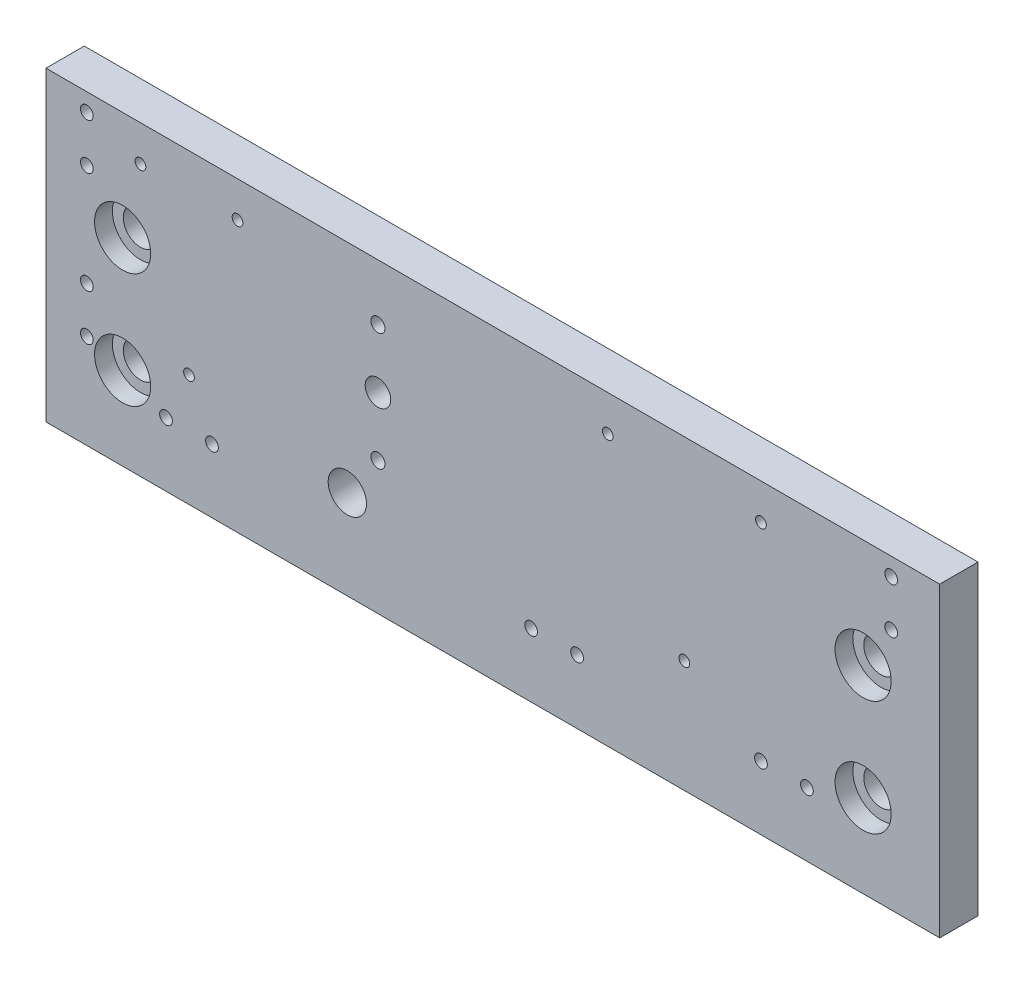
ISO-10303-21;
HEADER;
FILE_DESCRIPTION(('STEP AP214'),'2;1');
FILE_NAME('part.step','',(''),(''),'','','');
FILE_SCHEMA(('AUTOMOTIVE_DESIGN { 1 0 10303 214 1 1 1 1 }'));
ENDSEC;
DATA;
#1=APPLICATION_CONTEXT('core data for automotive mechanical design processes');
#2=APPLICATION_PROTOCOL_DEFINITION('international standard','automotive_design',2000,#1);
#3=PRODUCT_CONTEXT('',#1,'mechanical');
#4=PRODUCT('Part','Part','',(#3));
#5=PRODUCT_RELATED_PRODUCT_CATEGORY('part','',(#4));
#6=PRODUCT_DEFINITION_FORMATION('','',#4);
#7=PRODUCT_DEFINITION_CONTEXT('part definition',#1,'design');
#8=PRODUCT_DEFINITION('design','',#6,#7);
#9=PRODUCT_DEFINITION_SHAPE('','',#8);
#10=(LENGTH_UNIT() NAMED_UNIT(*) SI_UNIT(.MILLI.,.METRE.));
#11=(NAMED_UNIT(*) PLANE_ANGLE_UNIT() SI_UNIT($,.RADIAN.));
#12=(NAMED_UNIT(*) SI_UNIT($,.STERADIAN.) SOLID_ANGLE_UNIT());
#13=UNCERTAINTY_MEASURE_WITH_UNIT(LENGTH_MEASURE(1.E-05),#10,'distance_accuracy_value','');
#14=(GEOMETRIC_REPRESENTATION_CONTEXT(3) GLOBAL_UNCERTAINTY_ASSIGNED_CONTEXT((#13)) GLOBAL_UNIT_ASSIGNED_CONTEXT((#10,
#11,#12)) REPRESENTATION_CONTEXT('',''));
#15=CARTESIAN_POINT('',(0.,0.,0.));
#16=DIRECTION('',(0.,0.,1.));
#17=DIRECTION('',(1.,0.,0.));
#18=AXIS2_PLACEMENT_3D('',#15,#16,#17);
#19=CARTESIAN_POINT('',(30.,-42.5,7.5));
#20=DIRECTION('',(0.,0.,1.));
#21=DIRECTION('',(1.,0.,0.));
#22=AXIS2_PLACEMENT_3D('',#19,#20,#21);
#23=CYLINDRICAL_SURFACE('',#22,11.);
#24=CARTESIAN_POINT('',(30.,-42.5,7.5));
#25=DIRECTION('',(0.,0.,1.));
#26=DIRECTION('',(1.,0.,0.));
#27=AXIS2_PLACEMENT_3D('',#24,#25,#26);
#28=CIRCLE('',#27,11.);
#29=CARTESIAN_POINT('',(41.,-42.5,7.5));
#30=VERTEX_POINT('',#29);
#31=EDGE_CURVE('E246',#30,#30,#28,.F.);
#32=ORIENTED_EDGE('',*,*,#31,.F.);
#33=EDGE_LOOP('',(#32));
#34=FACE_BOUND('',#33,.T.);
#35=CARTESIAN_POINT('',(30.,-42.5,0.5));
#36=DIRECTION('',(0.,0.,1.));
#37=DIRECTION('',(1.,0.,0.));
#38=AXIS2_PLACEMENT_3D('',#35,#36,#37);
#39=CIRCLE('',#38,11.);
#40=CARTESIAN_POINT('',(41.,-42.5,0.5));
#41=VERTEX_POINT('',#40);
#42=EDGE_CURVE('E19',#41,#41,#39,.F.);
#43=ORIENTED_EDGE('',*,*,#42,.T.);
#44=EDGE_LOOP('',(#43));
#45=FACE_BOUND('',#44,.T.);
#46=ADVANCED_FACE('F16',(#34,#45),#23,.F.);
#47=CARTESIAN_POINT('',(320.,-42.5,7.5));
#48=DIRECTION('',(0.,0.,1.));
#49=DIRECTION('',(1.,0.,0.));
#50=AXIS2_PLACEMENT_3D('',#47,#48,#49);
#51=CYLINDRICAL_SURFACE('',#50,11.);
#52=CARTESIAN_POINT('',(320.,-42.5,7.5));
#53=DIRECTION('',(0.,0.,1.));
#54=DIRECTION('',(1.,0.,0.));
#55=AXIS2_PLACEMENT_3D('',#52,#53,#54);
#56=CIRCLE('',#55,11.);
#57=CARTESIAN_POINT('',(331.,-42.5,7.5));
#58=VERTEX_POINT('',#57);
#59=EDGE_CURVE('E243',#58,#58,#56,.F.);
#60=ORIENTED_EDGE('',*,*,#59,.F.);
#61=EDGE_LOOP('',(#60));
#62=FACE_BOUND('',#61,.T.);
#63=CARTESIAN_POINT('',(320.,-42.5,0.5));
#64=DIRECTION('',(0.,0.,1.));
#65=DIRECTION('',(1.,0.,0.));
#66=AXIS2_PLACEMENT_3D('',#63,#64,#65);
#67=CIRCLE('',#66,11.);
#68=CARTESIAN_POINT('',(331.,-42.5,0.5));
#69=VERTEX_POINT('',#68);
#70=EDGE_CURVE('E254',#69,#69,#67,.F.);
#71=ORIENTED_EDGE('',*,*,#70,.T.);
#72=EDGE_LOOP('',(#71));
#73=FACE_BOUND('',#72,.T.);
#74=ADVANCED_FACE('F344',(#62,#73),#51,.F.);
#75=CARTESIAN_POINT('',(320.,-87.5,7.5));
#76=DIRECTION('',(0.,0.,1.));
#77=DIRECTION('',(1.,0.,0.));
#78=AXIS2_PLACEMENT_3D('',#75,#76,#77);
#79=CYLINDRICAL_SURFACE('',#78,11.);
#80=CARTESIAN_POINT('',(320.,-87.5,7.5));
#81=DIRECTION('',(0.,0.,1.));
#82=DIRECTION('',(1.,0.,0.));
#83=AXIS2_PLACEMENT_3D('',#80,#81,#82);
#84=CIRCLE('',#83,11.);
#85=CARTESIAN_POINT('',(331.,-87.5,7.5));
#86=VERTEX_POINT('',#85);
#87=EDGE_CURVE('E240',#86,#86,#84,.F.);
#88=ORIENTED_EDGE('',*,*,#87,.F.);
#89=EDGE_LOOP('',(#88));
#90=FACE_BOUND('',#89,.T.);
#91=CARTESIAN_POINT('',(320.,-87.5,0.5));
#92=DIRECTION('',(0.,0.,1.));
#93=DIRECTION('',(1.,0.,0.));
#94=AXIS2_PLACEMENT_3D('',#91,#92,#93);
#95=CIRCLE('',#94,11.);
#96=CARTESIAN_POINT('',(331.,-87.5,0.5));
#97=VERTEX_POINT('',#96);
#98=EDGE_CURVE('E252',#97,#97,#95,.F.);
#99=ORIENTED_EDGE('',*,*,#98,.T.);
#100=EDGE_LOOP('',(#99));
#101=FACE_BOUND('',#100,.T.);
#102=ADVANCED_FACE('F341',(#90,#101),#79,.F.);
#103=CARTESIAN_POINT('',(30.,-87.5,7.5));
#104=DIRECTION('',(0.,0.,1.));
#105=DIRECTION('',(1.,0.,0.));
#106=AXIS2_PLACEMENT_3D('',#103,#104,#105);
#107=CYLINDRICAL_SURFACE('',#106,11.);
#108=CARTESIAN_POINT('',(30.,-87.5,7.5));
#109=DIRECTION('',(0.,0.,1.));
#110=DIRECTION('',(1.,0.,0.));
#111=AXIS2_PLACEMENT_3D('',#108,#109,#110);
#112=CIRCLE('',#111,11.);
#113=CARTESIAN_POINT('',(41.,-87.5,7.5));
#114=VERTEX_POINT('',#113);
#115=EDGE_CURVE('E237',#114,#114,#112,.F.);
#116=ORIENTED_EDGE('',*,*,#115,.F.);
#117=EDGE_LOOP('',(#116));
#118=FACE_BOUND('',#117,.T.);
#119=CARTESIAN_POINT('',(30.,-87.5,0.5));
#120=DIRECTION('',(0.,0.,1.));
#121=DIRECTION('',(1.,0.,0.));
#122=AXIS2_PLACEMENT_3D('',#119,#120,#121);
#123=CIRCLE('',#122,11.);
#124=CARTESIAN_POINT('',(41.,-87.5,0.5));
#125=VERTEX_POINT('',#124);
#126=EDGE_CURVE('E249',#125,#125,#123,.F.);
#127=ORIENTED_EDGE('',*,*,#126,.T.);
#128=EDGE_LOOP('',(#127));
#129=FACE_BOUND('',#128,.T.);
#130=ADVANCED_FACE('F266',(#118,#129),#107,.F.);
#131=CARTESIAN_POINT('',(36.75,-42.5,0.5));
#132=DIRECTION('',(0.,0.,-1.));
#133=DIRECTION('',(-1.,0.,0.));
#134=AXIS2_PLACEMENT_3D('',#131,#132,#133);
#135=PLANE('',#134);
#136=ORIENTED_EDGE('',*,*,#42,.F.);
#137=EDGE_LOOP('',(#136));
#138=FACE_BOUND('',#137,.T.);
#139=CARTESIAN_POINT('',(30.,-42.5,0.5));
#140=DIRECTION('',(0.,0.,1.));
#141=DIRECTION('',(1.,0.,0.));
#142=AXIS2_PLACEMENT_3D('',#139,#140,#141);
#143=CIRCLE('',#142,6.75);
#144=CARTESIAN_POINT('',(36.75,-42.5,0.5));
#145=VERTEX_POINT('',#144);
#146=EDGE_CURVE('E171',#145,#145,#143,.F.);
#147=ORIENTED_EDGE('',*,*,#146,.T.);
#148=EDGE_LOOP('',(#147));
#149=FACE_BOUND('',#148,.T.);
#150=ADVANCED_FACE('F262',(#138,#149),#135,.F.);
#151=CARTESIAN_POINT('',(326.75,-42.5,0.5));
#152=DIRECTION('',(0.,0.,-1.));
#153=DIRECTION('',(-1.,0.,0.));
#154=AXIS2_PLACEMENT_3D('',#151,#152,#153);
#155=PLANE('',#154);
#156=ORIENTED_EDGE('',*,*,#70,.F.);
#157=EDGE_LOOP('',(#156));
#158=FACE_BOUND('',#157,.T.);
#159=CARTESIAN_POINT('',(320.,-42.5,0.5));
#160=DIRECTION('',(0.,0.,1.));
#161=DIRECTION('',(1.,0.,0.));
#162=AXIS2_PLACEMENT_3D('',#159,#160,#161);
#163=CIRCLE('',#162,6.74999999999998);
#164=CARTESIAN_POINT('',(326.75,-42.5,0.5));
#165=VERTEX_POINT('',#164);
#166=EDGE_CURVE('E168',#165,#165,#163,.F.);
#167=ORIENTED_EDGE('',*,*,#166,.T.);
#168=EDGE_LOOP('',(#167));
#169=FACE_BOUND('',#168,.T.);
#170=ADVANCED_FACE('F265',(#158,#169),#155,.F.);
#171=CARTESIAN_POINT('',(326.75,-87.5,0.5));
#172=DIRECTION('',(0.,0.,-1.));
#173=DIRECTION('',(-1.,0.,0.));
#174=AXIS2_PLACEMENT_3D('',#171,#172,#173);
#175=PLANE('',#174);
#176=ORIENTED_EDGE('',*,*,#98,.F.);
#177=EDGE_LOOP('',(#176));
#178=FACE_BOUND('',#177,.T.);
#179=CARTESIAN_POINT('',(320.,-87.5,0.5));
#180=DIRECTION('',(0.,0.,1.));
#181=DIRECTION('',(1.,0.,0.));
#182=AXIS2_PLACEMENT_3D('',#179,#180,#181);
#183=CIRCLE('',#182,6.74999999999998);
#184=CARTESIAN_POINT('',(326.75,-87.5,0.5));
#185=VERTEX_POINT('',#184);
#186=EDGE_CURVE('E165',#185,#185,#183,.F.);
#187=ORIENTED_EDGE('',*,*,#186,.T.);
#188=EDGE_LOOP('',(#187));
#189=FACE_BOUND('',#188,.T.);
#190=ADVANCED_FACE('F323',(#178,#189),#175,.F.);
#191=CARTESIAN_POINT('',(36.75,-87.5,0.5));
#192=DIRECTION('',(0.,0.,-1.));
#193=DIRECTION('',(-1.,0.,0.));
#194=AXIS2_PLACEMENT_3D('',#191,#192,#193);
#195=PLANE('',#194);
#196=ORIENTED_EDGE('',*,*,#126,.F.);
#197=EDGE_LOOP('',(#196));
#198=FACE_BOUND('',#197,.T.);
#199=CARTESIAN_POINT('',(30.,-87.5,0.5));
#200=DIRECTION('',(0.,0.,1.));
#201=DIRECTION('',(1.,0.,0.));
#202=AXIS2_PLACEMENT_3D('',#199,#200,#201);
#203=CIRCLE('',#202,6.75);
#204=CARTESIAN_POINT('',(36.75,-87.5,0.5));
#205=VERTEX_POINT('',#204);
#206=EDGE_CURVE('E162',#205,#205,#203,.F.);
#207=ORIENTED_EDGE('',*,*,#206,.T.);
#208=EDGE_LOOP('',(#207));
#209=FACE_BOUND('',#208,.T.);
#210=ADVANCED_FACE('F325',(#198,#209),#195,.F.);
#211=CARTESIAN_POINT('',(0.,-120.,7.5));
#212=DIRECTION('',(0.,0.,1.));
#213=DIRECTION('',(1.,0.,0.));
#214=AXIS2_PLACEMENT_3D('',#211,#212,#213);
#215=PLANE('',#214);
#216=DIRECTION('',(0.,1.,0.));
#217=VECTOR('',#216,1.);
#218=CARTESIAN_POINT('',(350.,0.,7.5));
#219=LINE('',#218,#217);
#220=CARTESIAN_POINT('',(350.,-120.,7.5));
#221=VERTEX_POINT('',#220);
#222=CARTESIAN_POINT('',(350.,0.,7.5));
#223=VERTEX_POINT('',#222);
#224=EDGE_CURVE('E54',#221,#223,#219,.T.);
#225=ORIENTED_EDGE('',*,*,#224,.T.);
#226=DIRECTION('',(1.,0.,0.));
#227=VECTOR('',#226,1.);
#228=CARTESIAN_POINT('',(0.,0.,7.5));
#229=LINE('',#228,#227);
#230=CARTESIAN_POINT('',(0.,0.,7.5));
#231=VERTEX_POINT('',#230);
#232=EDGE_CURVE('E871',#223,#231,#229,.F.);
#233=ORIENTED_EDGE('',*,*,#232,.T.);
#234=DIRECTION('',(0.,1.,0.));
#235=VECTOR('',#234,1.);
#236=CARTESIAN_POINT('',(0.,0.,7.5));
#237=LINE('',#236,#235);
#238=CARTESIAN_POINT('',(0.,-120.,7.5));
#239=VERTEX_POINT('',#238);
#240=EDGE_CURVE('E60',#231,#239,#237,.F.);
#241=ORIENTED_EDGE('',*,*,#240,.T.);
#242=DIRECTION('',(1.,0.,0.));
#243=VECTOR('',#242,1.);
#244=CARTESIAN_POINT('',(0.,-120.,7.5));
#245=LINE('',#244,#243);
#246=EDGE_CURVE('E57',#239,#221,#245,.T.);
#247=ORIENTED_EDGE('',*,*,#246,.T.);
#248=EDGE_LOOP('',(#225,#233,#241,#247));
#249=FACE_BOUND('',#248,.T.);
#250=CARTESIAN_POINT('',(118.,-85.,7.5));
#251=DIRECTION('',(0.,0.,1.));
#252=DIRECTION('',(1.,0.,0.));
#253=AXIS2_PLACEMENT_3D('',#250,#251,#252);
#254=CIRCLE('',#253,7.50000000000003);
#255=CARTESIAN_POINT('',(125.5,-85.,7.5));
#256=VERTEX_POINT('',#255);
#257=EDGE_CURVE('E66',#256,#256,#254,.F.);
#258=ORIENTED_EDGE('',*,*,#257,.T.);
#259=EDGE_LOOP('',(#258));
#260=FACE_BOUND('',#259,.T.);
#261=ORIENTED_EDGE('',*,*,#115,.T.);
#262=EDGE_LOOP('',(#261));
#263=FACE_BOUND('',#262,.T.);
#264=ORIENTED_EDGE('',*,*,#87,.T.);
#265=EDGE_LOOP('',(#264));
#266=FACE_BOUND('',#265,.T.);
#267=ORIENTED_EDGE('',*,*,#59,.T.);
#268=EDGE_LOOP('',(#267));
#269=FACE_BOUND('',#268,.T.);
#270=ORIENTED_EDGE('',*,*,#31,.T.);
#271=EDGE_LOOP('',(#270));
#272=FACE_BOUND('',#271,.T.);
#273=CARTESIAN_POINT('',(280.,-14.,7.5));
#274=DIRECTION('',(0.,0.,1.));
#275=DIRECTION('',(1.,0.,0.));
#276=AXIS2_PLACEMENT_3D('',#273,#274,#275);
#277=CIRCLE('',#276,2.09999999999999);
#278=CARTESIAN_POINT('',(282.1,-14.,7.5));
#279=VERTEX_POINT('',#278);
#280=EDGE_CURVE('E174',#279,#279,#277,.F.);
#281=ORIENTED_EDGE('',*,*,#280,.T.);
#282=EDGE_LOOP('',(#281));
#283=FACE_BOUND('',#282,.T.);
#284=CARTESIAN_POINT('',(75.,-14.,7.5));
#285=DIRECTION('',(0.,0.,1.));
#286=DIRECTION('',(1.,0.,0.));
#287=AXIS2_PLACEMENT_3D('',#284,#285,#286);
#288=CIRCLE('',#287,2.09999999999999);
#289=CARTESIAN_POINT('',(77.1,-14.,7.5));
#290=VERTEX_POINT('',#289);
#291=EDGE_CURVE('E177',#290,#290,#288,.F.);
#292=ORIENTED_EDGE('',*,*,#291,.T.);
#293=EDGE_LOOP('',(#292));
#294=FACE_BOUND('',#293,.T.);
#295=CARTESIAN_POINT('',(250.,-76.,7.5));
#296=DIRECTION('',(0.,0.,1.));
#297=DIRECTION('',(1.,0.,0.));
#298=AXIS2_PLACEMENT_3D('',#295,#296,#297);
#299=CIRCLE('',#298,2.09999999999999);
#300=CARTESIAN_POINT('',(252.1,-76.,7.5));
#301=VERTEX_POINT('',#300);
#302=EDGE_CURVE('E180',#301,#301,#299,.F.);
#303=ORIENTED_EDGE('',*,*,#302,.T.);
#304=EDGE_LOOP('',(#303));
#305=FACE_BOUND('',#304,.T.);
#306=CARTESIAN_POINT('',(220.,-14.,7.5));
#307=DIRECTION('',(0.,0.,1.));
#308=DIRECTION('',(1.,0.,0.));
#309=AXIS2_PLACEMENT_3D('',#306,#307,#308);
#310=CIRCLE('',#309,2.09999999999999);
#311=CARTESIAN_POINT('',(222.1,-14.,7.5));
#312=VERTEX_POINT('',#311);
#313=EDGE_CURVE('E183',#312,#312,#310,.F.);
#314=ORIENTED_EDGE('',*,*,#313,.T.);
#315=EDGE_LOOP('',(#314));
#316=FACE_BOUND('',#315,.T.);
#317=CARTESIAN_POINT('',(37.,-14.,7.5));
#318=DIRECTION('',(0.,0.,1.));
#319=DIRECTION('',(1.,0.,0.));
#320=AXIS2_PLACEMENT_3D('',#317,#318,#319);
#321=CIRCLE('',#320,2.09999999999999);
#322=CARTESIAN_POINT('',(39.1,-14.,7.5));
#323=VERTEX_POINT('',#322);
#324=EDGE_CURVE('E186',#323,#323,#321,.F.);
#325=ORIENTED_EDGE('',*,*,#324,.T.);
#326=EDGE_LOOP('',(#325));
#327=FACE_BOUND('',#326,.T.);
#328=CARTESIAN_POINT('',(56.,-76.,7.5));
#329=DIRECTION('',(0.,0.,1.));
#330=DIRECTION('',(1.,0.,0.));
#331=AXIS2_PLACEMENT_3D('',#328,#329,#330);
#332=CIRCLE('',#331,2.09999999999999);
#333=CARTESIAN_POINT('',(58.1,-76.,7.5));
#334=VERTEX_POINT('',#333);
#335=EDGE_CURVE('E189',#334,#334,#332,.F.);
#336=ORIENTED_EDGE('',*,*,#335,.T.);
#337=EDGE_LOOP('',(#336));
#338=FACE_BOUND('',#337,.T.);
#339=CARTESIAN_POINT('',(298.,-95.,7.5));
#340=DIRECTION('',(0.,0.,1.));
#341=DIRECTION('',(1.,0.,0.));
#342=AXIS2_PLACEMENT_3D('',#339,#340,#341);
#343=CIRCLE('',#342,2.5);
#344=CARTESIAN_POINT('',(300.5,-95.,7.5));
#345=VERTEX_POINT('',#344);
#346=EDGE_CURVE('E192',#345,#345,#343,.F.);
#347=ORIENTED_EDGE('',*,*,#346,.T.);
#348=EDGE_LOOP('',(#347));
#349=FACE_BOUND('',#348,.T.);
#350=CARTESIAN_POINT('',(280.,-95.,7.5));
#351=DIRECTION('',(0.,0.,1.));
#352=DIRECTION('',(1.,0.,0.));
#353=AXIS2_PLACEMENT_3D('',#350,#351,#352);
#354=CIRCLE('',#353,2.5);
#355=CARTESIAN_POINT('',(282.5,-95.,7.5));
#356=VERTEX_POINT('',#355);
#357=EDGE_CURVE('E195',#356,#356,#354,.F.);
#358=ORIENTED_EDGE('',*,*,#357,.T.);
#359=EDGE_LOOP('',(#358));
#360=FACE_BOUND('',#359,.T.);
#361=CARTESIAN_POINT('',(208.,-95.,7.5));
#362=DIRECTION('',(0.,0.,1.));
#363=DIRECTION('',(1.,0.,0.));
#364=AXIS2_PLACEMENT_3D('',#361,#362,#363);
#365=CIRCLE('',#364,2.49999999999997);
#366=CARTESIAN_POINT('',(210.5,-95.,7.5));
#367=VERTEX_POINT('',#366);
#368=EDGE_CURVE('E198',#367,#367,#365,.F.);
#369=ORIENTED_EDGE('',*,*,#368,.T.);
#370=EDGE_LOOP('',(#369));
#371=FACE_BOUND('',#370,.T.);
#372=CARTESIAN_POINT('',(190.,-95.,7.5));
#373=DIRECTION('',(0.,0.,1.));
#374=DIRECTION('',(1.,0.,0.));
#375=AXIS2_PLACEMENT_3D('',#372,#373,#374);
#376=CIRCLE('',#375,2.5);
#377=CARTESIAN_POINT('',(192.5,-95.,7.5));
#378=VERTEX_POINT('',#377);
#379=EDGE_CURVE('E201',#378,#378,#376,.F.);
#380=ORIENTED_EDGE('',*,*,#379,.T.);
#381=EDGE_LOOP('',(#380));
#382=FACE_BOUND('',#381,.T.);
#383=CARTESIAN_POINT('',(331.,-25.,7.5));
#384=DIRECTION('',(0.,0.,1.));
#385=DIRECTION('',(1.,0.,0.));
#386=AXIS2_PLACEMENT_3D('',#383,#384,#385);
#387=CIRCLE('',#386,2.5);
#388=CARTESIAN_POINT('',(333.5,-25.,7.5));
#389=VERTEX_POINT('',#388);
#390=EDGE_CURVE('E204',#389,#389,#387,.F.);
#391=ORIENTED_EDGE('',*,*,#390,.T.);
#392=EDGE_LOOP('',(#391));
#393=FACE_BOUND('',#392,.T.);
#394=CARTESIAN_POINT('',(331.,-7.,7.5));
#395=DIRECTION('',(0.,0.,1.));
#396=DIRECTION('',(1.,0.,0.));
#397=AXIS2_PLACEMENT_3D('',#394,#395,#396);
#398=CIRCLE('',#397,2.5);
#399=CARTESIAN_POINT('',(333.5,-7.,7.5));
#400=VERTEX_POINT('',#399);
#401=EDGE_CURVE('E207',#400,#400,#398,.F.);
#402=ORIENTED_EDGE('',*,*,#401,.T.);
#403=EDGE_LOOP('',(#402));
#404=FACE_BOUND('',#403,.T.);
#405=CARTESIAN_POINT('',(65.,-95.,7.5));
#406=DIRECTION('',(0.,0.,1.));
#407=DIRECTION('',(1.,0.,0.));
#408=AXIS2_PLACEMENT_3D('',#405,#406,#407);
#409=CIRCLE('',#408,2.49999999999999);
#410=CARTESIAN_POINT('',(67.5,-95.,7.5));
#411=VERTEX_POINT('',#410);
#412=EDGE_CURVE('E210',#411,#411,#409,.F.);
#413=ORIENTED_EDGE('',*,*,#412,.T.);
#414=EDGE_LOOP('',(#413));
#415=FACE_BOUND('',#414,.T.);
#416=CARTESIAN_POINT('',(47.,-95.,7.5));
#417=DIRECTION('',(0.,0.,1.));
#418=DIRECTION('',(1.,0.,0.));
#419=AXIS2_PLACEMENT_3D('',#416,#417,#418);
#420=CIRCLE('',#419,2.49999999999999);
#421=CARTESIAN_POINT('',(49.5,-95.,7.5));
#422=VERTEX_POINT('',#421);
#423=EDGE_CURVE('E213',#422,#422,#420,.F.);
#424=ORIENTED_EDGE('',*,*,#423,.T.);
#425=EDGE_LOOP('',(#424));
#426=FACE_BOUND('',#425,.T.);
#427=CARTESIAN_POINT('',(16.,-83.,7.5));
#428=DIRECTION('',(0.,0.,1.));
#429=DIRECTION('',(1.,0.,0.));
#430=AXIS2_PLACEMENT_3D('',#427,#428,#429);
#431=CIRCLE('',#430,2.49999999999999);
#432=CARTESIAN_POINT('',(18.5,-83.,7.5));
#433=VERTEX_POINT('',#432);
#434=EDGE_CURVE('E216',#433,#433,#431,.F.);
#435=ORIENTED_EDGE('',*,*,#434,.T.);
#436=EDGE_LOOP('',(#435));
#437=FACE_BOUND('',#436,.T.);
#438=CARTESIAN_POINT('',(16.,-65.,7.5));
#439=DIRECTION('',(0.,0.,1.));
#440=DIRECTION('',(1.,0.,0.));
#441=AXIS2_PLACEMENT_3D('',#438,#439,#440);
#442=CIRCLE('',#441,2.49999999999999);
#443=CARTESIAN_POINT('',(18.5,-65.,7.5));
#444=VERTEX_POINT('',#443);
#445=EDGE_CURVE('E219',#444,#444,#442,.F.);
#446=ORIENTED_EDGE('',*,*,#445,.T.);
#447=EDGE_LOOP('',(#446));
#448=FACE_BOUND('',#447,.T.);
#449=CARTESIAN_POINT('',(16.,-25.,7.5));
#450=DIRECTION('',(0.,0.,1.));
#451=DIRECTION('',(1.,0.,0.));
#452=AXIS2_PLACEMENT_3D('',#449,#450,#451);
#453=CIRCLE('',#452,2.49999999999999);
#454=CARTESIAN_POINT('',(18.5,-25.,7.5));
#455=VERTEX_POINT('',#454);
#456=EDGE_CURVE('E222',#455,#455,#453,.F.);
#457=ORIENTED_EDGE('',*,*,#456,.T.);
#458=EDGE_LOOP('',(#457));
#459=FACE_BOUND('',#458,.T.);
#460=CARTESIAN_POINT('',(16.,-7.,7.5));
#461=DIRECTION('',(0.,0.,1.));
#462=DIRECTION('',(1.,0.,0.));
#463=AXIS2_PLACEMENT_3D('',#460,#461,#462);
#464=CIRCLE('',#463,2.49999999999999);
#465=CARTESIAN_POINT('',(18.5,-7.,7.5));
#466=VERTEX_POINT('',#465);
#467=EDGE_CURVE('E225',#466,#466,#464,.F.);
#468=ORIENTED_EDGE('',*,*,#467,.T.);
#469=EDGE_LOOP('',(#468));
#470=FACE_BOUND('',#469,.T.);
#471=CARTESIAN_POINT('',(130.,-45.,7.5));
#472=DIRECTION('',(0.,0.,1.));
#473=DIRECTION('',(1.,0.,0.));
#474=AXIS2_PLACEMENT_3D('',#471,#472,#473);
#475=CIRCLE('',#474,5.);
#476=CARTESIAN_POINT('',(135.,-45.,7.5));
#477=VERTEX_POINT('',#476);
#478=EDGE_CURVE('E228',#477,#477,#475,.F.);
#479=ORIENTED_EDGE('',*,*,#478,.T.);
#480=EDGE_LOOP('',(#479));
#481=FACE_BOUND('',#480,.T.);
#482=CARTESIAN_POINT('',(130.,-68.,7.5));
#483=DIRECTION('',(0.,0.,1.));
#484=DIRECTION('',(1.,0.,0.));
#485=AXIS2_PLACEMENT_3D('',#482,#483,#484);
#486=CIRCLE('',#485,2.75);
#487=CARTESIAN_POINT('',(132.75,-68.,7.5));
#488=VERTEX_POINT('',#487);
#489=EDGE_CURVE('E231',#488,#488,#486,.F.);
#490=ORIENTED_EDGE('',*,*,#489,.T.);
#491=EDGE_LOOP('',(#490));
#492=FACE_BOUND('',#491,.T.);
#493=CARTESIAN_POINT('',(130.,-22.,7.5));
#494=DIRECTION('',(0.,0.,1.));
#495=DIRECTION('',(1.,0.,0.));
#496=AXIS2_PLACEMENT_3D('',#493,#494,#495);
#497=CIRCLE('',#496,2.74999999999997);
#498=CARTESIAN_POINT('',(132.75,-22.,7.5));
#499=VERTEX_POINT('',#498);
#500=EDGE_CURVE('E234',#499,#499,#497,.F.);
#501=ORIENTED_EDGE('',*,*,#500,.T.);
#502=EDGE_LOOP('',(#501));
#503=FACE_BOUND('',#502,.T.);
#504=ADVANCED_FACE('F58',(#249,#260,#263,#266,#269,#272,#283,#294,#305,#316,#327,#338,#349,#360,
#371,#382,#393,#404,#415,#426,#437,#448,#459,#470,#481,#492,#503),#215,.T.);
#505=CARTESIAN_POINT('',(130.,-22.,7.5));
#506=DIRECTION('',(0.,0.,1.));
#507=DIRECTION('',(1.,0.,0.));
#508=AXIS2_PLACEMENT_3D('',#505,#506,#507);
#509=CYLINDRICAL_SURFACE('',#508,2.74999999999997);
#510=CARTESIAN_POINT('',(130.,-22.,-7.5));
#511=DIRECTION('',(0.,0.,1.));
#512=DIRECTION('',(1.,0.,0.));
#513=AXIS2_PLACEMENT_3D('',#510,#511,#512);
#514=CIRCLE('',#513,2.74999999999997);
#515=CARTESIAN_POINT('',(132.75,-22.,-7.5));
#516=VERTEX_POINT('',#515);
#517=EDGE_CURVE('E156',#516,#516,#514,.F.);
#518=ORIENTED_EDGE('',*,*,#517,.T.);
#519=EDGE_LOOP('',(#518));
#520=FACE_BOUND('',#519,.T.);
#521=ORIENTED_EDGE('',*,*,#500,.F.);
#522=EDGE_LOOP('',(#521));
#523=FACE_BOUND('',#522,.T.);
#524=ADVANCED_FACE('F356',(#520,#523),#509,.F.);
#525=CARTESIAN_POINT('',(130.,-68.,7.5));
#526=DIRECTION('',(0.,0.,1.));
#527=DIRECTION('',(1.,0.,0.));
#528=AXIS2_PLACEMENT_3D('',#525,#526,#527);
#529=CYLINDRICAL_SURFACE('',#528,2.75);
#530=CARTESIAN_POINT('',(130.,-68.,-7.5));
#531=DIRECTION('',(0.,0.,1.));
#532=DIRECTION('',(1.,0.,0.));
#533=AXIS2_PLACEMENT_3D('',#530,#531,#532);
#534=CIRCLE('',#533,2.75);
#535=CARTESIAN_POINT('',(132.75,-68.,-7.5));
#536=VERTEX_POINT('',#535);
#537=EDGE_CURVE('E153',#536,#536,#534,.F.);
#538=ORIENTED_EDGE('',*,*,#537,.T.);
#539=EDGE_LOOP('',(#538));
#540=FACE_BOUND('',#539,.T.);
#541=ORIENTED_EDGE('',*,*,#489,.F.);
#542=EDGE_LOOP('',(#541));
#543=FACE_BOUND('',#542,.T.);
#544=ADVANCED_FACE('F402',(#540,#543),#529,.F.);
#545=CARTESIAN_POINT('',(130.,-45.,7.5));
#546=DIRECTION('',(0.,0.,1.));
#547=DIRECTION('',(1.,0.,0.));
#548=AXIS2_PLACEMENT_3D('',#545,#546,#547);
#549=CYLINDRICAL_SURFACE('',#548,5.);
#550=CARTESIAN_POINT('',(130.,-45.,-7.5));
#551=DIRECTION('',(0.,0.,1.));
#552=DIRECTION('',(1.,0.,0.));
#553=AXIS2_PLACEMENT_3D('',#550,#551,#552);
#554=CIRCLE('',#553,5.);
#555=CARTESIAN_POINT('',(135.,-45.,-7.5));
#556=VERTEX_POINT('',#555);
#557=EDGE_CURVE('E150',#556,#556,#554,.F.);
#558=ORIENTED_EDGE('',*,*,#557,.T.);
#559=EDGE_LOOP('',(#558));
#560=FACE_BOUND('',#559,.T.);
#561=ORIENTED_EDGE('',*,*,#478,.F.);
#562=EDGE_LOOP('',(#561));
#563=FACE_BOUND('',#562,.T.);
#564=ADVANCED_FACE('F408',(#560,#563),#549,.F.);
#565=CARTESIAN_POINT('',(16.,-7.,7.5));
#566=DIRECTION('',(0.,0.,1.));
#567=DIRECTION('',(1.,0.,0.));
#568=AXIS2_PLACEMENT_3D('',#565,#566,#567);
#569=CYLINDRICAL_SURFACE('',#568,2.49999999999999);
#570=CARTESIAN_POINT('',(16.,-7.,-7.5));
#571=DIRECTION('',(0.,0.,1.));
#572=DIRECTION('',(1.,0.,0.));
#573=AXIS2_PLACEMENT_3D('',#570,#571,#572);
#574=CIRCLE('',#573,2.49999999999999);
#575=CARTESIAN_POINT('',(18.5,-7.,-7.5));
#576=VERTEX_POINT('',#575);
#577=EDGE_CURVE('E147',#576,#576,#574,.F.);
#578=ORIENTED_EDGE('',*,*,#577,.T.);
#579=EDGE_LOOP('',(#578));
#580=FACE_BOUND('',#579,.T.);
#581=ORIENTED_EDGE('',*,*,#467,.F.);
#582=EDGE_LOOP('',(#581));
#583=FACE_BOUND('',#582,.T.);
#584=ADVANCED_FACE('F414',(#580,#583),#569,.F.);
#585=CARTESIAN_POINT('',(16.,-25.,7.5));
#586=DIRECTION('',(0.,0.,1.));
#587=DIRECTION('',(1.,0.,0.));
#588=AXIS2_PLACEMENT_3D('',#585,#586,#587);
#589=CYLINDRICAL_SURFACE('',#588,2.49999999999999);
#590=CARTESIAN_POINT('',(16.,-25.,-7.5));
#591=DIRECTION('',(0.,0.,1.));
#592=DIRECTION('',(1.,0.,0.));
#593=AXIS2_PLACEMENT_3D('',#590,#591,#592);
#594=CIRCLE('',#593,2.49999999999999);
#595=CARTESIAN_POINT('',(18.5,-25.,-7.5));
#596=VERTEX_POINT('',#595);
#597=EDGE_CURVE('E144',#596,#596,#594,.F.);
#598=ORIENTED_EDGE('',*,*,#597,.T.);
#599=EDGE_LOOP('',(#598));
#600=FACE_BOUND('',#599,.T.);
#601=ORIENTED_EDGE('',*,*,#456,.F.);
#602=EDGE_LOOP('',(#601));
#603=FACE_BOUND('',#602,.T.);
#604=ADVANCED_FACE('F418',(#600,#603),#589,.F.);
#605=CARTESIAN_POINT('',(16.,-65.,7.5));
#606=DIRECTION('',(0.,0.,1.));
#607=DIRECTION('',(1.,0.,0.));
#608=AXIS2_PLACEMENT_3D('',#605,#606,#607);
#609=CYLINDRICAL_SURFACE('',#608,2.49999999999999);
#610=CARTESIAN_POINT('',(16.,-65.,-7.5));
#611=DIRECTION('',(0.,0.,1.));
#612=DIRECTION('',(1.,0.,0.));
#613=AXIS2_PLACEMENT_3D('',#610,#611,#612);
#614=CIRCLE('',#613,2.49999999999999);
#615=CARTESIAN_POINT('',(18.5,-65.,-7.5));
#616=VERTEX_POINT('',#615);
#617=EDGE_CURVE('E141',#616,#616,#614,.F.);
#618=ORIENTED_EDGE('',*,*,#617,.T.);
#619=EDGE_LOOP('',(#618));
#620=FACE_BOUND('',#619,.T.);
#621=ORIENTED_EDGE('',*,*,#445,.F.);
#622=EDGE_LOOP('',(#621));
#623=FACE_BOUND('',#622,.T.);
#624=ADVANCED_FACE('F422',(#620,#623),#609,.F.);
#625=CARTESIAN_POINT('',(16.,-83.,7.5));
#626=DIRECTION('',(0.,0.,1.));
#627=DIRECTION('',(1.,0.,0.));
#628=AXIS2_PLACEMENT_3D('',#625,#626,#627);
#629=CYLINDRICAL_SURFACE('',#628,2.49999999999999);
#630=CARTESIAN_POINT('',(16.,-83.,-7.5));
#631=DIRECTION('',(0.,0.,1.));
#632=DIRECTION('',(1.,0.,0.));
#633=AXIS2_PLACEMENT_3D('',#630,#631,#632);
#634=CIRCLE('',#633,2.49999999999999);
#635=CARTESIAN_POINT('',(18.5,-83.,-7.5));
#636=VERTEX_POINT('',#635);
#637=EDGE_CURVE('E138',#636,#636,#634,.F.);
#638=ORIENTED_EDGE('',*,*,#637,.T.);
#639=EDGE_LOOP('',(#638));
#640=FACE_BOUND('',#639,.T.);
#641=ORIENTED_EDGE('',*,*,#434,.F.);
#642=EDGE_LOOP('',(#641));
#643=FACE_BOUND('',#642,.T.);
#644=ADVANCED_FACE('F426',(#640,#643),#629,.F.);
#645=CARTESIAN_POINT('',(47.,-95.,7.5));
#646=DIRECTION('',(0.,0.,1.));
#647=DIRECTION('',(1.,0.,0.));
#648=AXIS2_PLACEMENT_3D('',#645,#646,#647);
#649=CYLINDRICAL_SURFACE('',#648,2.49999999999999);
#650=CARTESIAN_POINT('',(47.,-95.,-7.5));
#651=DIRECTION('',(0.,0.,1.));
#652=DIRECTION('',(1.,0.,0.));
#653=AXIS2_PLACEMENT_3D('',#650,#651,#652);
#654=CIRCLE('',#653,2.49999999999999);
#655=CARTESIAN_POINT('',(49.5,-95.,-7.5));
#656=VERTEX_POINT('',#655);
#657=EDGE_CURVE('E135',#656,#656,#654,.F.);
#658=ORIENTED_EDGE('',*,*,#657,.T.);
#659=EDGE_LOOP('',(#658));
#660=FACE_BOUND('',#659,.T.);
#661=ORIENTED_EDGE('',*,*,#423,.F.);
#662=EDGE_LOOP('',(#661));
#663=FACE_BOUND('',#662,.T.);
#664=ADVANCED_FACE('F430',(#660,#663),#649,.F.);
#665=CARTESIAN_POINT('',(65.,-95.,7.5));
#666=DIRECTION('',(0.,0.,1.));
#667=DIRECTION('',(1.,0.,0.));
#668=AXIS2_PLACEMENT_3D('',#665,#666,#667);
#669=CYLINDRICAL_SURFACE('',#668,2.49999999999999);
#670=CARTESIAN_POINT('',(65.,-95.,-7.5));
#671=DIRECTION('',(0.,0.,1.));
#672=DIRECTION('',(1.,0.,0.));
#673=AXIS2_PLACEMENT_3D('',#670,#671,#672);
#674=CIRCLE('',#673,2.49999999999999);
#675=CARTESIAN_POINT('',(67.5,-95.,-7.5));
#676=VERTEX_POINT('',#675);
#677=EDGE_CURVE('E132',#676,#676,#674,.F.);
#678=ORIENTED_EDGE('',*,*,#677,.T.);
#679=EDGE_LOOP('',(#678));
#680=FACE_BOUND('',#679,.T.);
#681=ORIENTED_EDGE('',*,*,#412,.F.);
#682=EDGE_LOOP('',(#681));
#683=FACE_BOUND('',#682,.T.);
#684=ADVANCED_FACE('F434',(#680,#683),#669,.F.);
#685=CARTESIAN_POINT('',(331.,-7.,7.5));
#686=DIRECTION('',(0.,0.,1.));
#687=DIRECTION('',(1.,0.,0.));
#688=AXIS2_PLACEMENT_3D('',#685,#686,#687);
#689=CYLINDRICAL_SURFACE('',#688,2.5);
#690=CARTESIAN_POINT('',(331.,-7.,-7.5));
#691=DIRECTION('',(0.,0.,1.));
#692=DIRECTION('',(1.,0.,0.));
#693=AXIS2_PLACEMENT_3D('',#690,#691,#692);
#694=CIRCLE('',#693,2.5);
#695=CARTESIAN_POINT('',(333.5,-7.,-7.5));
#696=VERTEX_POINT('',#695);
#697=EDGE_CURVE('E129',#696,#696,#694,.F.);
#698=ORIENTED_EDGE('',*,*,#697,.T.);
#699=EDGE_LOOP('',(#698));
#700=FACE_BOUND('',#699,.T.);
#701=ORIENTED_EDGE('',*,*,#401,.F.);
#702=EDGE_LOOP('',(#701));
#703=FACE_BOUND('',#702,.T.);
#704=ADVANCED_FACE('F438',(#700,#703),#689,.F.);
#705=CARTESIAN_POINT('',(331.,-25.,7.5));
#706=DIRECTION('',(0.,0.,1.));
#707=DIRECTION('',(1.,0.,0.));
#708=AXIS2_PLACEMENT_3D('',#705,#706,#707);
#709=CYLINDRICAL_SURFACE('',#708,2.5);
#710=CARTESIAN_POINT('',(331.,-25.,-7.5));
#711=DIRECTION('',(0.,0.,1.));
#712=DIRECTION('',(1.,0.,0.));
#713=AXIS2_PLACEMENT_3D('',#710,#711,#712);
#714=CIRCLE('',#713,2.5);
#715=CARTESIAN_POINT('',(333.5,-25.,-7.5));
#716=VERTEX_POINT('',#715);
#717=EDGE_CURVE('E126',#716,#716,#714,.F.);
#718=ORIENTED_EDGE('',*,*,#717,.T.);
#719=EDGE_LOOP('',(#718));
#720=FACE_BOUND('',#719,.T.);
#721=ORIENTED_EDGE('',*,*,#390,.F.);
#722=EDGE_LOOP('',(#721));
#723=FACE_BOUND('',#722,.T.);
#724=ADVANCED_FACE('F442',(#720,#723),#709,.F.);
#725=CARTESIAN_POINT('',(190.,-95.,7.5));
#726=DIRECTION('',(0.,0.,1.));
#727=DIRECTION('',(1.,0.,0.));
#728=AXIS2_PLACEMENT_3D('',#725,#726,#727);
#729=CYLINDRICAL_SURFACE('',#728,2.5);
#730=CARTESIAN_POINT('',(190.,-95.,-7.5));
#731=DIRECTION('',(0.,0.,1.));
#732=DIRECTION('',(1.,0.,0.));
#733=AXIS2_PLACEMENT_3D('',#730,#731,#732);
#734=CIRCLE('',#733,2.5);
#735=CARTESIAN_POINT('',(192.5,-95.,-7.5));
#736=VERTEX_POINT('',#735);
#737=EDGE_CURVE('E123',#736,#736,#734,.F.);
#738=ORIENTED_EDGE('',*,*,#737,.T.);
#739=EDGE_LOOP('',(#738));
#740=FACE_BOUND('',#739,.T.);
#741=ORIENTED_EDGE('',*,*,#379,.F.);
#742=EDGE_LOOP('',(#741));
#743=FACE_BOUND('',#742,.T.);
#744=ADVANCED_FACE('F446',(#740,#743),#729,.F.);
#745=CARTESIAN_POINT('',(208.,-95.,7.5));
#746=DIRECTION('',(0.,0.,1.));
#747=DIRECTION('',(1.,0.,0.));
#748=AXIS2_PLACEMENT_3D('',#745,#746,#747);
#749=CYLINDRICAL_SURFACE('',#748,2.49999999999997);
#750=CARTESIAN_POINT('',(208.,-95.,-7.5));
#751=DIRECTION('',(0.,0.,1.));
#752=DIRECTION('',(1.,0.,0.));
#753=AXIS2_PLACEMENT_3D('',#750,#751,#752);
#754=CIRCLE('',#753,2.49999999999997);
#755=CARTESIAN_POINT('',(210.5,-95.,-7.5));
#756=VERTEX_POINT('',#755);
#757=EDGE_CURVE('E120',#756,#756,#754,.F.);
#758=ORIENTED_EDGE('',*,*,#757,.T.);
#759=EDGE_LOOP('',(#758));
#760=FACE_BOUND('',#759,.T.);
#761=ORIENTED_EDGE('',*,*,#368,.F.);
#762=EDGE_LOOP('',(#761));
#763=FACE_BOUND('',#762,.T.);
#764=ADVANCED_FACE('F450',(#760,#763),#749,.F.);
#765=CARTESIAN_POINT('',(280.,-95.,7.5));
#766=DIRECTION('',(0.,0.,1.));
#767=DIRECTION('',(1.,0.,0.));
#768=AXIS2_PLACEMENT_3D('',#765,#766,#767);
#769=CYLINDRICAL_SURFACE('',#768,2.5);
#770=CARTESIAN_POINT('',(280.,-95.,-7.5));
#771=DIRECTION('',(0.,0.,1.));
#772=DIRECTION('',(1.,0.,0.));
#773=AXIS2_PLACEMENT_3D('',#770,#771,#772);
#774=CIRCLE('',#773,2.5);
#775=CARTESIAN_POINT('',(282.5,-95.,-7.5));
#776=VERTEX_POINT('',#775);
#777=EDGE_CURVE('E117',#776,#776,#774,.F.);
#778=ORIENTED_EDGE('',*,*,#777,.T.);
#779=EDGE_LOOP('',(#778));
#780=FACE_BOUND('',#779,.T.);
#781=ORIENTED_EDGE('',*,*,#357,.F.);
#782=EDGE_LOOP('',(#781));
#783=FACE_BOUND('',#782,.T.);
#784=ADVANCED_FACE('F454',(#780,#783),#769,.F.);
#785=CARTESIAN_POINT('',(298.,-95.,7.5));
#786=DIRECTION('',(0.,0.,1.));
#787=DIRECTION('',(1.,0.,0.));
#788=AXIS2_PLACEMENT_3D('',#785,#786,#787);
#789=CYLINDRICAL_SURFACE('',#788,2.5);
#790=CARTESIAN_POINT('',(298.,-95.,-7.5));
#791=DIRECTION('',(0.,0.,1.));
#792=DIRECTION('',(1.,0.,0.));
#793=AXIS2_PLACEMENT_3D('',#790,#791,#792);
#794=CIRCLE('',#793,2.5);
#795=CARTESIAN_POINT('',(300.5,-95.,-7.5));
#796=VERTEX_POINT('',#795);
#797=EDGE_CURVE('E114',#796,#796,#794,.F.);
#798=ORIENTED_EDGE('',*,*,#797,.T.);
#799=EDGE_LOOP('',(#798));
#800=FACE_BOUND('',#799,.T.);
#801=ORIENTED_EDGE('',*,*,#346,.F.);
#802=EDGE_LOOP('',(#801));
#803=FACE_BOUND('',#802,.T.);
#804=ADVANCED_FACE('F458',(#800,#803),#789,.F.);
#805=CARTESIAN_POINT('',(56.,-76.,7.5));
#806=DIRECTION('',(0.,0.,1.));
#807=DIRECTION('',(1.,0.,0.));
#808=AXIS2_PLACEMENT_3D('',#805,#806,#807);
#809=CYLINDRICAL_SURFACE('',#808,2.09999999999999);
#810=CARTESIAN_POINT('',(56.,-76.,-7.5));
#811=DIRECTION('',(0.,0.,1.));
#812=DIRECTION('',(1.,0.,0.));
#813=AXIS2_PLACEMENT_3D('',#810,#811,#812);
#814=CIRCLE('',#813,2.09999999999999);
#815=CARTESIAN_POINT('',(58.1,-76.,-7.5));
#816=VERTEX_POINT('',#815);
#817=EDGE_CURVE('E111',#816,#816,#814,.F.);
#818=ORIENTED_EDGE('',*,*,#817,.T.);
#819=EDGE_LOOP('',(#818));
#820=FACE_BOUND('',#819,.T.);
#821=ORIENTED_EDGE('',*,*,#335,.F.);
#822=EDGE_LOOP('',(#821));
#823=FACE_BOUND('',#822,.T.);
#824=ADVANCED_FACE('F462',(#820,#823),#809,.F.);
#825=CARTESIAN_POINT('',(37.,-14.,7.5));
#826=DIRECTION('',(0.,0.,1.));
#827=DIRECTION('',(1.,0.,0.));
#828=AXIS2_PLACEMENT_3D('',#825,#826,#827);
#829=CYLINDRICAL_SURFACE('',#828,2.09999999999999);
#830=CARTESIAN_POINT('',(37.,-14.,-7.5));
#831=DIRECTION('',(0.,0.,1.));
#832=DIRECTION('',(1.,0.,0.));
#833=AXIS2_PLACEMENT_3D('',#830,#831,#832);
#834=CIRCLE('',#833,2.09999999999999);
#835=CARTESIAN_POINT('',(39.1,-14.,-7.5));
#836=VERTEX_POINT('',#835);
#837=EDGE_CURVE('E108',#836,#836,#834,.F.);
#838=ORIENTED_EDGE('',*,*,#837,.T.);
#839=EDGE_LOOP('',(#838));
#840=FACE_BOUND('',#839,.T.);
#841=ORIENTED_EDGE('',*,*,#324,.F.);
#842=EDGE_LOOP('',(#841));
#843=FACE_BOUND('',#842,.T.);
#844=ADVANCED_FACE('F466',(#840,#843),#829,.F.);
#845=CARTESIAN_POINT('',(220.,-14.,7.5));
#846=DIRECTION('',(0.,0.,1.));
#847=DIRECTION('',(1.,0.,0.));
#848=AXIS2_PLACEMENT_3D('',#845,#846,#847);
#849=CYLINDRICAL_SURFACE('',#848,2.09999999999999);
#850=CARTESIAN_POINT('',(220.,-14.,-7.5));
#851=DIRECTION('',(0.,0.,1.));
#852=DIRECTION('',(1.,0.,0.));
#853=AXIS2_PLACEMENT_3D('',#850,#851,#852);
#854=CIRCLE('',#853,2.09999999999999);
#855=CARTESIAN_POINT('',(222.1,-14.,-7.5));
#856=VERTEX_POINT('',#855);
#857=EDGE_CURVE('E105',#856,#856,#854,.F.);
#858=ORIENTED_EDGE('',*,*,#857,.T.);
#859=EDGE_LOOP('',(#858));
#860=FACE_BOUND('',#859,.T.);
#861=ORIENTED_EDGE('',*,*,#313,.F.);
#862=EDGE_LOOP('',(#861));
#863=FACE_BOUND('',#862,.T.);
#864=ADVANCED_FACE('F470',(#860,#863),#849,.F.);
#865=CARTESIAN_POINT('',(250.,-76.,7.5));
#866=DIRECTION('',(0.,0.,1.));
#867=DIRECTION('',(1.,0.,0.));
#868=AXIS2_PLACEMENT_3D('',#865,#866,#867);
#869=CYLINDRICAL_SURFACE('',#868,2.09999999999999);
#870=CARTESIAN_POINT('',(250.,-76.,-7.5));
#871=DIRECTION('',(0.,0.,1.));
#872=DIRECTION('',(1.,0.,0.));
#873=AXIS2_PLACEMENT_3D('',#870,#871,#872);
#874=CIRCLE('',#873,2.09999999999999);
#875=CARTESIAN_POINT('',(252.1,-76.,-7.5));
#876=VERTEX_POINT('',#875);
#877=EDGE_CURVE('E102',#876,#876,#874,.F.);
#878=ORIENTED_EDGE('',*,*,#877,.T.);
#879=EDGE_LOOP('',(#878));
#880=FACE_BOUND('',#879,.T.);
#881=ORIENTED_EDGE('',*,*,#302,.F.);
#882=EDGE_LOOP('',(#881));
#883=FACE_BOUND('',#882,.T.);
#884=ADVANCED_FACE('F474',(#880,#883),#869,.F.);
#885=CARTESIAN_POINT('',(75.,-14.,7.5));
#886=DIRECTION('',(0.,0.,1.));
#887=DIRECTION('',(1.,0.,0.));
#888=AXIS2_PLACEMENT_3D('',#885,#886,#887);
#889=CYLINDRICAL_SURFACE('',#888,2.09999999999999);
#890=CARTESIAN_POINT('',(75.,-14.,-7.5));
#891=DIRECTION('',(0.,0.,1.));
#892=DIRECTION('',(1.,0.,0.));
#893=AXIS2_PLACEMENT_3D('',#890,#891,#892);
#894=CIRCLE('',#893,2.09999999999999);
#895=CARTESIAN_POINT('',(77.1,-14.,-7.5));
#896=VERTEX_POINT('',#895);
#897=EDGE_CURVE('E99',#896,#896,#894,.F.);
#898=ORIENTED_EDGE('',*,*,#897,.T.);
#899=EDGE_LOOP('',(#898));
#900=FACE_BOUND('',#899,.T.);
#901=ORIENTED_EDGE('',*,*,#291,.F.);
#902=EDGE_LOOP('',(#901));
#903=FACE_BOUND('',#902,.T.);
#904=ADVANCED_FACE('F284',(#900,#903),#889,.F.);
#905=CARTESIAN_POINT('',(280.,-14.,7.5));
#906=DIRECTION('',(0.,0.,1.));
#907=DIRECTION('',(1.,0.,0.));
#908=AXIS2_PLACEMENT_3D('',#905,#906,#907);
#909=CYLINDRICAL_SURFACE('',#908,2.09999999999999);
#910=CARTESIAN_POINT('',(280.,-14.,-7.5));
#911=DIRECTION('',(0.,0.,1.));
#912=DIRECTION('',(1.,0.,0.));
#913=AXIS2_PLACEMENT_3D('',#910,#911,#912);
#914=CIRCLE('',#913,2.09999999999999);
#915=CARTESIAN_POINT('',(282.1,-14.,-7.5));
#916=VERTEX_POINT('',#915);
#917=EDGE_CURVE('E96',#916,#916,#914,.F.);
#918=ORIENTED_EDGE('',*,*,#917,.T.);
#919=EDGE_LOOP('',(#918));
#920=FACE_BOUND('',#919,.T.);
#921=ORIENTED_EDGE('',*,*,#280,.F.);
#922=EDGE_LOOP('',(#921));
#923=FACE_BOUND('',#922,.T.);
#924=ADVANCED_FACE('F273',(#920,#923),#909,.F.);
#925=CARTESIAN_POINT('',(30.,-42.5,7.5));
#926=DIRECTION('',(0.,0.,1.));
#927=DIRECTION('',(1.,0.,0.));
#928=AXIS2_PLACEMENT_3D('',#925,#926,#927);
#929=CYLINDRICAL_SURFACE('',#928,6.75);
#930=CARTESIAN_POINT('',(30.,-42.5,-7.5));
#931=DIRECTION('',(0.,0.,1.));
#932=DIRECTION('',(1.,0.,0.));
#933=AXIS2_PLACEMENT_3D('',#930,#931,#932);
#934=CIRCLE('',#933,6.75);
#935=CARTESIAN_POINT('',(36.75,-42.5,-7.5));
#936=VERTEX_POINT('',#935);
#937=EDGE_CURVE('E93',#936,#936,#934,.F.);
#938=ORIENTED_EDGE('',*,*,#937,.T.);
#939=EDGE_LOOP('',(#938));
#940=FACE_BOUND('',#939,.T.);
#941=ORIENTED_EDGE('',*,*,#146,.F.);
#942=EDGE_LOOP('',(#941));
#943=FACE_BOUND('',#942,.T.);
#944=ADVANCED_FACE('F270',(#940,#943),#929,.F.);
#945=CARTESIAN_POINT('',(320.,-42.5,7.5));
#946=DIRECTION('',(0.,0.,1.));
#947=DIRECTION('',(1.,0.,0.));
#948=AXIS2_PLACEMENT_3D('',#945,#946,#947);
#949=CYLINDRICAL_SURFACE('',#948,6.74999999999998);
#950=CARTESIAN_POINT('',(320.,-42.5,-7.5));
#951=DIRECTION('',(0.,0.,1.));
#952=DIRECTION('',(1.,0.,0.));
#953=AXIS2_PLACEMENT_3D('',#950,#951,#952);
#954=CIRCLE('',#953,6.74999999999998);
#955=CARTESIAN_POINT('',(326.75,-42.5,-7.5));
#956=VERTEX_POINT('',#955);
#957=EDGE_CURVE('E90',#956,#956,#954,.F.);
#958=ORIENTED_EDGE('',*,*,#957,.T.);
#959=EDGE_LOOP('',(#958));
#960=FACE_BOUND('',#959,.T.);
#961=ORIENTED_EDGE('',*,*,#166,.F.);
#962=EDGE_LOOP('',(#961));
#963=FACE_BOUND('',#962,.T.);
#964=ADVANCED_FACE('F272',(#960,#963),#949,.F.);
#965=CARTESIAN_POINT('',(320.,-87.5,7.5));
#966=DIRECTION('',(0.,0.,1.));
#967=DIRECTION('',(1.,0.,0.));
#968=AXIS2_PLACEMENT_3D('',#965,#966,#967);
#969=CYLINDRICAL_SURFACE('',#968,6.74999999999998);
#970=CARTESIAN_POINT('',(320.,-87.5,-7.5));
#971=DIRECTION('',(0.,0.,1.));
#972=DIRECTION('',(1.,0.,0.));
#973=AXIS2_PLACEMENT_3D('',#970,#971,#972);
#974=CIRCLE('',#973,6.74999999999998);
#975=CARTESIAN_POINT('',(326.75,-87.5,-7.5));
#976=VERTEX_POINT('',#975);
#977=EDGE_CURVE('E87',#976,#976,#974,.F.);
#978=ORIENTED_EDGE('',*,*,#977,.T.);
#979=EDGE_LOOP('',(#978));
#980=FACE_BOUND('',#979,.T.);
#981=ORIENTED_EDGE('',*,*,#186,.F.);
#982=EDGE_LOOP('',(#981));
#983=FACE_BOUND('',#982,.T.);
#984=ADVANCED_FACE('F281',(#980,#983),#969,.F.);
#985=CARTESIAN_POINT('',(30.,-87.5,7.5));
#986=DIRECTION('',(0.,0.,1.));
#987=DIRECTION('',(1.,0.,0.));
#988=AXIS2_PLACEMENT_3D('',#985,#986,#987);
#989=CYLINDRICAL_SURFACE('',#988,6.75);
#990=CARTESIAN_POINT('',(30.,-87.5,-7.5));
#991=DIRECTION('',(0.,0.,1.));
#992=DIRECTION('',(1.,0.,0.));
#993=AXIS2_PLACEMENT_3D('',#990,#991,#992);
#994=CIRCLE('',#993,6.75);
#995=CARTESIAN_POINT('',(36.75,-87.5,-7.5));
#996=VERTEX_POINT('',#995);
#997=EDGE_CURVE('E84',#996,#996,#994,.F.);
#998=ORIENTED_EDGE('',*,*,#997,.T.);
#999=EDGE_LOOP('',(#998));
#1000=FACE_BOUND('',#999,.T.);
#1001=ORIENTED_EDGE('',*,*,#206,.F.);
#1002=EDGE_LOOP('',(#1001));
#1003=FACE_BOUND('',#1002,.T.);
#1004=ADVANCED_FACE('F310',(#1000,#1003),#989,.F.);
#1005=CARTESIAN_POINT('',(118.,-85.,-7.5));
#1006=DIRECTION('',(0.,0.,1.));
#1007=DIRECTION('',(1.,0.,0.));
#1008=AXIS2_PLACEMENT_3D('',#1005,#1006,#1007);
#1009=CYLINDRICAL_SURFACE('',#1008,7.50000000000003);
#1010=CARTESIAN_POINT('',(118.,-85.,-7.5));
#1011=DIRECTION('',(0.,0.,1.));
#1012=DIRECTION('',(1.,0.,0.));
#1013=AXIS2_PLACEMENT_3D('',#1010,#1011,#1012);
#1014=CIRCLE('',#1013,7.50000000000003);
#1015=CARTESIAN_POINT('',(125.5,-85.,-7.5));
#1016=VERTEX_POINT('',#1015);
#1017=EDGE_CURVE('E81',#1016,#1016,#1014,.F.);
#1018=ORIENTED_EDGE('',*,*,#1017,.T.);
#1019=EDGE_LOOP('',(#1018));
#1020=FACE_BOUND('',#1019,.T.);
#1021=ORIENTED_EDGE('',*,*,#257,.F.);
#1022=EDGE_LOOP('',(#1021));
#1023=FACE_BOUND('',#1022,.T.);
#1024=ADVANCED_FACE('F307',(#1020,#1023),#1009,.F.);
#1025=CARTESIAN_POINT('',(0.,-120.,7.5));
#1026=DIRECTION('',(0.,1.,0.));
#1027=DIRECTION('',(0.,0.,1.));
#1028=AXIS2_PLACEMENT_3D('',#1025,#1026,#1027);
#1029=PLANE('',#1028);
#1030=DIRECTION('',(0.,0.,1.));
#1031=VECTOR('',#1030,1.);
#1032=CARTESIAN_POINT('',(350.,-120.,7.5));
#1033=LINE('',#1032,#1031);
#1034=CARTESIAN_POINT('',(350.,-120.,-7.5));
#1035=VERTEX_POINT('',#1034);
#1036=EDGE_CURVE('E65',#1035,#221,#1033,.T.);
#1037=ORIENTED_EDGE('',*,*,#1036,.T.);
#1038=ORIENTED_EDGE('',*,*,#246,.F.);
#1039=DIRECTION('',(0.,0.,1.));
#1040=VECTOR('',#1039,1.);
#1041=CARTESIAN_POINT('',(0.,-120.,7.5));
#1042=LINE('',#1041,#1040);
#1043=CARTESIAN_POINT('',(0.,-120.,-7.5));
#1044=VERTEX_POINT('',#1043);
#1045=EDGE_CURVE('E159',#239,#1044,#1042,.F.);
#1046=ORIENTED_EDGE('',*,*,#1045,.T.);
#1047=DIRECTION('',(1.,0.,0.));
#1048=VECTOR('',#1047,1.);
#1049=CARTESIAN_POINT('',(0.,-120.,-7.5));
#1050=LINE('',#1049,#1048);
#1051=EDGE_CURVE('E77',#1044,#1035,#1050,.T.);
#1052=ORIENTED_EDGE('',*,*,#1051,.T.);
#1053=EDGE_LOOP('',(#1037,#1038,#1046,#1052));
#1054=FACE_BOUND('',#1053,.T.);
#1055=ADVANCED_FACE('F76',(#1054),#1029,.F.);
#1056=CARTESIAN_POINT('',(350.,0.,7.5));
#1057=DIRECTION('',(-1.,0.,0.));
#1058=DIRECTION('',(0.,0.,1.));
#1059=AXIS2_PLACEMENT_3D('',#1056,#1057,#1058);
#1060=PLANE('',#1059);
#1061=DIRECTION('',(0.,0.,-1.));
#1062=VECTOR('',#1061,1.);
#1063=CARTESIAN_POINT('',(350.,0.,7.5));
#1064=LINE('',#1063,#1062);
#1065=CARTESIAN_POINT('',(350.,0.,-7.5));
#1066=VERTEX_POINT('',#1065);
#1067=EDGE_CURVE('E73',#1066,#223,#1064,.F.);
#1068=ORIENTED_EDGE('',*,*,#1067,.T.);
#1069=ORIENTED_EDGE('',*,*,#224,.F.);
#1070=ORIENTED_EDGE('',*,*,#1036,.F.);
#1071=DIRECTION('',(0.,1.,0.));
#1072=VECTOR('',#1071,1.);
#1073=CARTESIAN_POINT('',(350.,-120.,-7.5));
#1074=LINE('',#1073,#1072);
#1075=EDGE_CURVE('E878',#1035,#1066,#1074,.T.);
#1076=ORIENTED_EDGE('',*,*,#1075,.T.);
#1077=EDGE_LOOP('',(#1068,#1069,#1070,#1076));
#1078=FACE_BOUND('',#1077,.T.);
#1079=ADVANCED_FACE('F70',(#1078),#1060,.F.);
#1080=CARTESIAN_POINT('',(0.,0.,7.5));
#1081=DIRECTION('',(0.,-1.,0.));
#1082=DIRECTION('',(0.,0.,-1.));
#1083=AXIS2_PLACEMENT_3D('',#1080,#1081,#1082);
#1084=PLANE('',#1083);
#1085=DIRECTION('',(0.,0.,1.));
#1086=VECTOR('',#1085,1.);
#1087=CARTESIAN_POINT('',(0.,0.,7.5));
#1088=LINE('',#1087,#1086);
#1089=CARTESIAN_POINT('',(0.,0.,-7.5));
#1090=VERTEX_POINT('',#1089);
#1091=EDGE_CURVE('E33',#1090,#231,#1088,.T.);
#1092=ORIENTED_EDGE('',*,*,#1091,.T.);
#1093=ORIENTED_EDGE('',*,*,#232,.F.);
#1094=ORIENTED_EDGE('',*,*,#1067,.F.);
#1095=DIRECTION('',(1.,0.,0.));
#1096=VECTOR('',#1095,1.);
#1097=CARTESIAN_POINT('',(0.,0.,-7.5));
#1098=LINE('',#1097,#1096);
#1099=EDGE_CURVE('E25',#1066,#1090,#1098,.F.);
#1100=ORIENTED_EDGE('',*,*,#1099,.T.);
#1101=EDGE_LOOP('',(#1092,#1093,#1094,#1100));
#1102=FACE_BOUND('',#1101,.T.);
#1103=ADVANCED_FACE('F295',(#1102),#1084,.F.);
#1104=CARTESIAN_POINT('',(0.,0.,7.5));
#1105=DIRECTION('',(1.,0.,0.));
#1106=DIRECTION('',(0.,1.,0.));
#1107=AXIS2_PLACEMENT_3D('',#1104,#1105,#1106);
#1108=PLANE('',#1107);
#1109=ORIENTED_EDGE('',*,*,#1045,.F.);
#1110=ORIENTED_EDGE('',*,*,#240,.F.);
#1111=ORIENTED_EDGE('',*,*,#1091,.F.);
#1112=DIRECTION('',(0.,1.,0.));
#1113=VECTOR('',#1112,1.);
#1114=CARTESIAN_POINT('',(0.,-120.,-7.5));
#1115=LINE('',#1114,#1113);
#1116=EDGE_CURVE('E11',#1090,#1044,#1115,.F.);
#1117=ORIENTED_EDGE('',*,*,#1116,.T.);
#1118=EDGE_LOOP('',(#1109,#1110,#1111,#1117));
#1119=FACE_BOUND('',#1118,.T.);
#1120=ADVANCED_FACE('F289',(#1119),#1108,.F.);
#1121=CARTESIAN_POINT('',(0.,-120.,-7.5));
#1122=DIRECTION('',(0.,0.,1.));
#1123=DIRECTION('',(1.,0.,0.));
#1124=AXIS2_PLACEMENT_3D('',#1121,#1122,#1123);
#1125=PLANE('',#1124);
#1126=ORIENTED_EDGE('',*,*,#1099,.F.);
#1127=ORIENTED_EDGE('',*,*,#1075,.F.);
#1128=ORIENTED_EDGE('',*,*,#1051,.F.);
#1129=ORIENTED_EDGE('',*,*,#1116,.F.);
#1130=EDGE_LOOP('',(#1126,#1127,#1128,#1129));
#1131=FACE_BOUND('',#1130,.T.);
#1132=ORIENTED_EDGE('',*,*,#1017,.F.);
#1133=EDGE_LOOP('',(#1132));
#1134=FACE_BOUND('',#1133,.T.);
#1135=ORIENTED_EDGE('',*,*,#997,.F.);
#1136=EDGE_LOOP('',(#1135));
#1137=FACE_BOUND('',#1136,.T.);
#1138=ORIENTED_EDGE('',*,*,#977,.F.);
#1139=EDGE_LOOP('',(#1138));
#1140=FACE_BOUND('',#1139,.T.);
#1141=ORIENTED_EDGE('',*,*,#957,.F.);
#1142=EDGE_LOOP('',(#1141));
#1143=FACE_BOUND('',#1142,.T.);
#1144=ORIENTED_EDGE('',*,*,#937,.F.);
#1145=EDGE_LOOP('',(#1144));
#1146=FACE_BOUND('',#1145,.T.);
#1147=ORIENTED_EDGE('',*,*,#917,.F.);
#1148=EDGE_LOOP('',(#1147));
#1149=FACE_BOUND('',#1148,.T.);
#1150=ORIENTED_EDGE('',*,*,#897,.F.);
#1151=EDGE_LOOP('',(#1150));
#1152=FACE_BOUND('',#1151,.T.);
#1153=ORIENTED_EDGE('',*,*,#877,.F.);
#1154=EDGE_LOOP('',(#1153));
#1155=FACE_BOUND('',#1154,.T.);
#1156=ORIENTED_EDGE('',*,*,#857,.F.);
#1157=EDGE_LOOP('',(#1156));
#1158=FACE_BOUND('',#1157,.T.);
#1159=ORIENTED_EDGE('',*,*,#837,.F.);
#1160=EDGE_LOOP('',(#1159));
#1161=FACE_BOUND('',#1160,.T.);
#1162=ORIENTED_EDGE('',*,*,#817,.F.);
#1163=EDGE_LOOP('',(#1162));
#1164=FACE_BOUND('',#1163,.T.);
#1165=ORIENTED_EDGE('',*,*,#797,.F.);
#1166=EDGE_LOOP('',(#1165));
#1167=FACE_BOUND('',#1166,.T.);
#1168=ORIENTED_EDGE('',*,*,#777,.F.);
#1169=EDGE_LOOP('',(#1168));
#1170=FACE_BOUND('',#1169,.T.);
#1171=ORIENTED_EDGE('',*,*,#757,.F.);
#1172=EDGE_LOOP('',(#1171));
#1173=FACE_BOUND('',#1172,.T.);
#1174=ORIENTED_EDGE('',*,*,#737,.F.);
#1175=EDGE_LOOP('',(#1174));
#1176=FACE_BOUND('',#1175,.T.);
#1177=ORIENTED_EDGE('',*,*,#717,.F.);
#1178=EDGE_LOOP('',(#1177));
#1179=FACE_BOUND('',#1178,.T.);
#1180=ORIENTED_EDGE('',*,*,#697,.F.);
#1181=EDGE_LOOP('',(#1180));
#1182=FACE_BOUND('',#1181,.T.);
#1183=ORIENTED_EDGE('',*,*,#677,.F.);
#1184=EDGE_LOOP('',(#1183));
#1185=FACE_BOUND('',#1184,.T.);
#1186=ORIENTED_EDGE('',*,*,#657,.F.);
#1187=EDGE_LOOP('',(#1186));
#1188=FACE_BOUND('',#1187,.T.);
#1189=ORIENTED_EDGE('',*,*,#637,.F.);
#1190=EDGE_LOOP('',(#1189));
#1191=FACE_BOUND('',#1190,.T.);
#1192=ORIENTED_EDGE('',*,*,#617,.F.);
#1193=EDGE_LOOP('',(#1192));
#1194=FACE_BOUND('',#1193,.T.);
#1195=ORIENTED_EDGE('',*,*,#597,.F.);
#1196=EDGE_LOOP('',(#1195));
#1197=FACE_BOUND('',#1196,.T.);
#1198=ORIENTED_EDGE('',*,*,#577,.F.);
#1199=EDGE_LOOP('',(#1198));
#1200=FACE_BOUND('',#1199,.T.);
#1201=ORIENTED_EDGE('',*,*,#557,.F.);
#1202=EDGE_LOOP('',(#1201));
#1203=FACE_BOUND('',#1202,.T.);
#1204=ORIENTED_EDGE('',*,*,#537,.F.);
#1205=EDGE_LOOP('',(#1204));
#1206=FACE_BOUND('',#1205,.T.);
#1207=ORIENTED_EDGE('',*,*,#517,.F.);
#1208=EDGE_LOOP('',(#1207));
#1209=FACE_BOUND('',#1208,.T.);
#1210=ADVANCED_FACE('F287',(#1131,#1134,#1137,#1140,#1143,#1146,#1149,#1152,#1155,#1158,#1161,
#1164,#1167,#1170,#1173,#1176,#1179,#1182,#1185,#1188,#1191,#1194,#1197,#1200,#1203,#1206,
#1209),#1125,.F.);
#1211=CLOSED_SHELL('',(#46,#74,#102,#130,#150,#170,#190,#210,#504,#524,#544,#564,#584,#604,#624,
#644,#664,#684,#704,#724,#744,#764,#784,#804,#824,#844,#864,#884,#904,#924,#944,#964,#984,#1004,
#1024,#1055,#1079,#1103,#1120,#1210));
#1212=MANIFOLD_SOLID_BREP('B1',#1211);
#1213=ADVANCED_BREP_SHAPE_REPRESENTATION('',(#18,#1212),#14);
#1214=SHAPE_DEFINITION_REPRESENTATION(#9,#1213);
ENDSEC;
END-ISO-10303-21;
